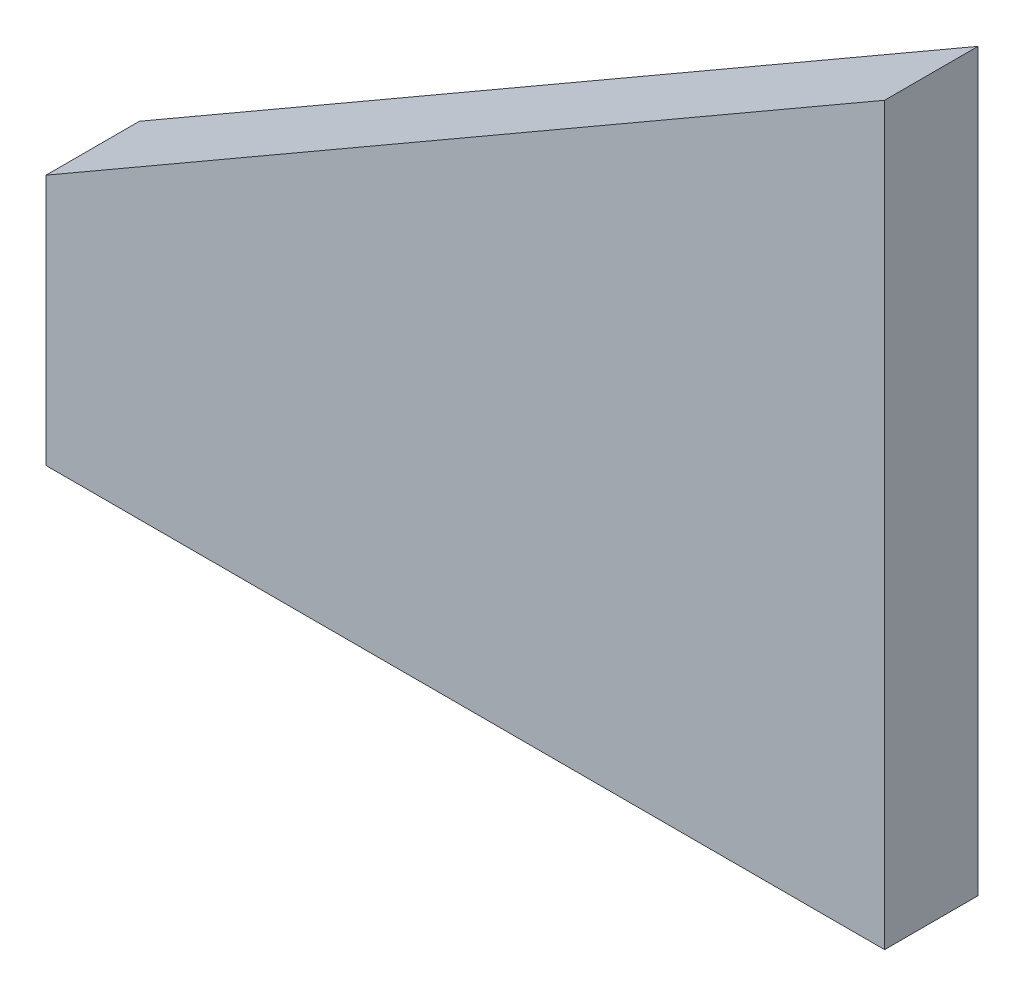
ISO-10303-21;
HEADER;
FILE_DESCRIPTION(('STEP AP214'),'2;1');
FILE_NAME('part.step','',(''),(''),'','','');
FILE_SCHEMA(('AUTOMOTIVE_DESIGN { 1 0 10303 214 1 1 1 1 }'));
ENDSEC;
DATA;
#1=APPLICATION_CONTEXT('core data for automotive mechanical design processes');
#2=APPLICATION_PROTOCOL_DEFINITION('international standard','automotive_design',2000,#1);
#3=PRODUCT_CONTEXT('',#1,'mechanical');
#4=PRODUCT('Part','Part','',(#3));
#5=PRODUCT_RELATED_PRODUCT_CATEGORY('part','',(#4));
#6=PRODUCT_DEFINITION_FORMATION('','',#4);
#7=PRODUCT_DEFINITION_CONTEXT('part definition',#1,'design');
#8=PRODUCT_DEFINITION('design','',#6,#7);
#9=PRODUCT_DEFINITION_SHAPE('','',#8);
#10=(LENGTH_UNIT() NAMED_UNIT(*) SI_UNIT(.MILLI.,.METRE.));
#11=(NAMED_UNIT(*) PLANE_ANGLE_UNIT() SI_UNIT($,.RADIAN.));
#12=(NAMED_UNIT(*) SI_UNIT($,.STERADIAN.) SOLID_ANGLE_UNIT());
#13=UNCERTAINTY_MEASURE_WITH_UNIT(LENGTH_MEASURE(1.E-05),#10,'distance_accuracy_value','');
#14=(GEOMETRIC_REPRESENTATION_CONTEXT(3) GLOBAL_UNCERTAINTY_ASSIGNED_CONTEXT((#13)) GLOBAL_UNIT_ASSIGNED_CONTEXT((#10,
#11,#12)) REPRESENTATION_CONTEXT('',''));
#15=CARTESIAN_POINT('',(0.,0.,0.));
#16=DIRECTION('',(0.,0.,1.));
#17=DIRECTION('',(1.,0.,0.));
#18=AXIS2_PLACEMENT_3D('',#15,#16,#17);
#19=CARTESIAN_POINT('',(-114.,-65.8179306876181,6.35));
#20=DIRECTION('',(0.500000000000004,-0.866025403784436,0.));
#21=DIRECTION('',(0.866025403784436,0.500000000000004,0.));
#22=AXIS2_PLACEMENT_3D('',#19,#20,#21);
#23=PLANE('',#22);
#24=DIRECTION('',(-0.866025403784436,-0.500000000000004,0.));
#25=VECTOR('',#24,1.);
#26=CARTESIAN_POINT('',(-114.,-65.8179306876181,-6.35));
#27=LINE('',#26,#25);
#28=CARTESIAN_POINT('',(0.,0.,-6.35));
#29=VERTEX_POINT('',#28);
#30=CARTESIAN_POINT('',(-114.,-65.8179306876181,-6.35));
#31=VERTEX_POINT('',#30);
#32=EDGE_CURVE('E96',#29,#31,#27,.T.);
#33=ORIENTED_EDGE('',*,*,#32,.T.);
#34=DIRECTION('',(0.,0.,-1.));
#35=VECTOR('',#34,1.);
#36=CARTESIAN_POINT('',(-114.,-65.8179306876181,6.35));
#37=LINE('',#36,#35);
#38=CARTESIAN_POINT('',(-114.,-65.8179306876181,6.35));
#39=VERTEX_POINT('',#38);
#40=EDGE_CURVE('E11',#39,#31,#37,.T.);
#41=ORIENTED_EDGE('',*,*,#40,.F.);
#42=DIRECTION('',(-0.866025403784436,-0.500000000000004,0.));
#43=VECTOR('',#42,1.);
#44=CARTESIAN_POINT('',(-114.,-65.8179306876181,6.35));
#45=LINE('',#44,#43);
#46=CARTESIAN_POINT('',(0.,0.,6.35));
#47=VERTEX_POINT('',#46);
#48=EDGE_CURVE('E84',#47,#39,#45,.T.);
#49=ORIENTED_EDGE('',*,*,#48,.F.);
#50=DIRECTION('',(0.,0.,-1.));
#51=VECTOR('',#50,1.);
#52=CARTESIAN_POINT('',(0.,0.,6.35));
#53=LINE('',#52,#51);
#54=EDGE_CURVE('E92',#47,#29,#53,.T.);
#55=ORIENTED_EDGE('',*,*,#54,.T.);
#56=EDGE_LOOP('',(#33,#41,#49,#55));
#57=FACE_BOUND('',#56,.T.);
#58=ADVANCED_FACE('F33',(#57),#23,.F.);
#59=CARTESIAN_POINT('',(-114.,-65.8179306876181,6.35));
#60=DIRECTION('',(1.,0.,0.));
#61=DIRECTION('',(0.,0.,-1.));
#62=AXIS2_PLACEMENT_3D('',#59,#60,#61);
#63=PLANE('',#62);
#64=DIRECTION('',(0.,-1.,0.));
#65=VECTOR('',#64,1.);
#66=CARTESIAN_POINT('',(-114.,-65.8179306876181,-6.35));
#67=LINE('',#66,#65);
#68=CARTESIAN_POINT('',(-114.,-100.,-6.35));
#69=VERTEX_POINT('',#68);
#70=EDGE_CURVE('E88',#31,#69,#67,.T.);
#71=ORIENTED_EDGE('',*,*,#70,.T.);
#72=DIRECTION('',(0.,0.,-1.));
#73=VECTOR('',#72,1.);
#74=CARTESIAN_POINT('',(-114.,-100.,6.35));
#75=LINE('',#74,#73);
#76=CARTESIAN_POINT('',(-114.,-100.,6.35));
#77=VERTEX_POINT('',#76);
#78=EDGE_CURVE('E41',#77,#69,#75,.T.);
#79=ORIENTED_EDGE('',*,*,#78,.F.);
#80=DIRECTION('',(0.,-1.,0.));
#81=VECTOR('',#80,1.);
#82=CARTESIAN_POINT('',(-114.,-65.8179306876181,6.35));
#83=LINE('',#82,#81);
#84=EDGE_CURVE('E79',#39,#77,#83,.T.);
#85=ORIENTED_EDGE('',*,*,#84,.F.);
#86=ORIENTED_EDGE('',*,*,#40,.T.);
#87=EDGE_LOOP('',(#71,#79,#85,#86));
#88=FACE_BOUND('',#87,.T.);
#89=ADVANCED_FACE('F87',(#88),#63,.F.);
#90=CARTESIAN_POINT('',(0.,-100.,6.35));
#91=DIRECTION('',(0.,1.,0.));
#92=DIRECTION('',(-1.,0.,0.));
#93=AXIS2_PLACEMENT_3D('',#90,#91,#92);
#94=PLANE('',#93);
#95=DIRECTION('',(1.,0.,0.));
#96=VECTOR('',#95,1.);
#97=CARTESIAN_POINT('',(0.,-100.,-6.35));
#98=LINE('',#97,#96);
#99=CARTESIAN_POINT('',(0.,-100.,-6.35));
#100=VERTEX_POINT('',#99);
#101=EDGE_CURVE('E66',#69,#100,#98,.T.);
#102=ORIENTED_EDGE('',*,*,#101,.T.);
#103=DIRECTION('',(0.,0.,-1.));
#104=VECTOR('',#103,1.);
#105=CARTESIAN_POINT('',(0.,-100.,6.35));
#106=LINE('',#105,#104);
#107=CARTESIAN_POINT('',(0.,-100.,6.35));
#108=VERTEX_POINT('',#107);
#109=EDGE_CURVE('E89',#108,#100,#106,.T.);
#110=ORIENTED_EDGE('',*,*,#109,.F.);
#111=DIRECTION('',(1.,0.,0.));
#112=VECTOR('',#111,1.);
#113=CARTESIAN_POINT('',(0.,-100.,6.35));
#114=LINE('',#113,#112);
#115=EDGE_CURVE('E82',#77,#108,#114,.T.);
#116=ORIENTED_EDGE('',*,*,#115,.F.);
#117=ORIENTED_EDGE('',*,*,#78,.T.);
#118=EDGE_LOOP('',(#102,#110,#116,#117));
#119=FACE_BOUND('',#118,.T.);
#120=ADVANCED_FACE('F90',(#119),#94,.F.);
#121=CARTESIAN_POINT('',(0.,0.,6.35));
#122=DIRECTION('',(-1.,0.,0.));
#123=DIRECTION('',(0.,-1.,0.));
#124=AXIS2_PLACEMENT_3D('',#121,#122,#123);
#125=PLANE('',#124);
#126=DIRECTION('',(0.,1.,0.));
#127=VECTOR('',#126,1.);
#128=CARTESIAN_POINT('',(0.,0.,-6.35));
#129=LINE('',#128,#127);
#130=EDGE_CURVE('E72',#100,#29,#129,.T.);
#131=ORIENTED_EDGE('',*,*,#130,.T.);
#132=ORIENTED_EDGE('',*,*,#54,.F.);
#133=DIRECTION('',(0.,1.,0.));
#134=VECTOR('',#133,1.);
#135=CARTESIAN_POINT('',(0.,0.,6.35));
#136=LINE('',#135,#134);
#137=EDGE_CURVE('E49',#108,#47,#136,.T.);
#138=ORIENTED_EDGE('',*,*,#137,.F.);
#139=ORIENTED_EDGE('',*,*,#109,.T.);
#140=EDGE_LOOP('',(#131,#132,#138,#139));
#141=FACE_BOUND('',#140,.T.);
#142=ADVANCED_FACE('F103',(#141),#125,.F.);
#143=CARTESIAN_POINT('',(0.,0.,6.35));
#144=DIRECTION('',(0.,0.,-1.));
#145=DIRECTION('',(-1.,0.,0.));
#146=AXIS2_PLACEMENT_3D('',#143,#144,#145);
#147=PLANE('',#146);
#148=ORIENTED_EDGE('',*,*,#48,.T.);
#149=ORIENTED_EDGE('',*,*,#84,.T.);
#150=ORIENTED_EDGE('',*,*,#115,.T.);
#151=ORIENTED_EDGE('',*,*,#137,.T.);
#152=EDGE_LOOP('',(#148,#149,#150,#151));
#153=FACE_BOUND('',#152,.T.);
#154=ADVANCED_FACE('F80',(#153),#147,.F.);
#155=CARTESIAN_POINT('',(0.,0.,-6.35));
#156=DIRECTION('',(0.,0.,-1.));
#157=DIRECTION('',(-1.,0.,0.));
#158=AXIS2_PLACEMENT_3D('',#155,#156,#157);
#159=PLANE('',#158);
#160=ORIENTED_EDGE('',*,*,#32,.F.);
#161=ORIENTED_EDGE('',*,*,#130,.F.);
#162=ORIENTED_EDGE('',*,*,#101,.F.);
#163=ORIENTED_EDGE('',*,*,#70,.F.);
#164=EDGE_LOOP('',(#160,#161,#162,#163));
#165=FACE_BOUND('',#164,.T.);
#166=ADVANCED_FACE('F106',(#165),#159,.T.);
#167=CLOSED_SHELL('',(#58,#89,#120,#142,#154,#166));
#168=MANIFOLD_SOLID_BREP('B2',#167);
#169=ADVANCED_BREP_SHAPE_REPRESENTATION('',(#18,#168),#14);
#170=SHAPE_DEFINITION_REPRESENTATION(#9,#169);
ENDSEC;
END-ISO-10303-21;
